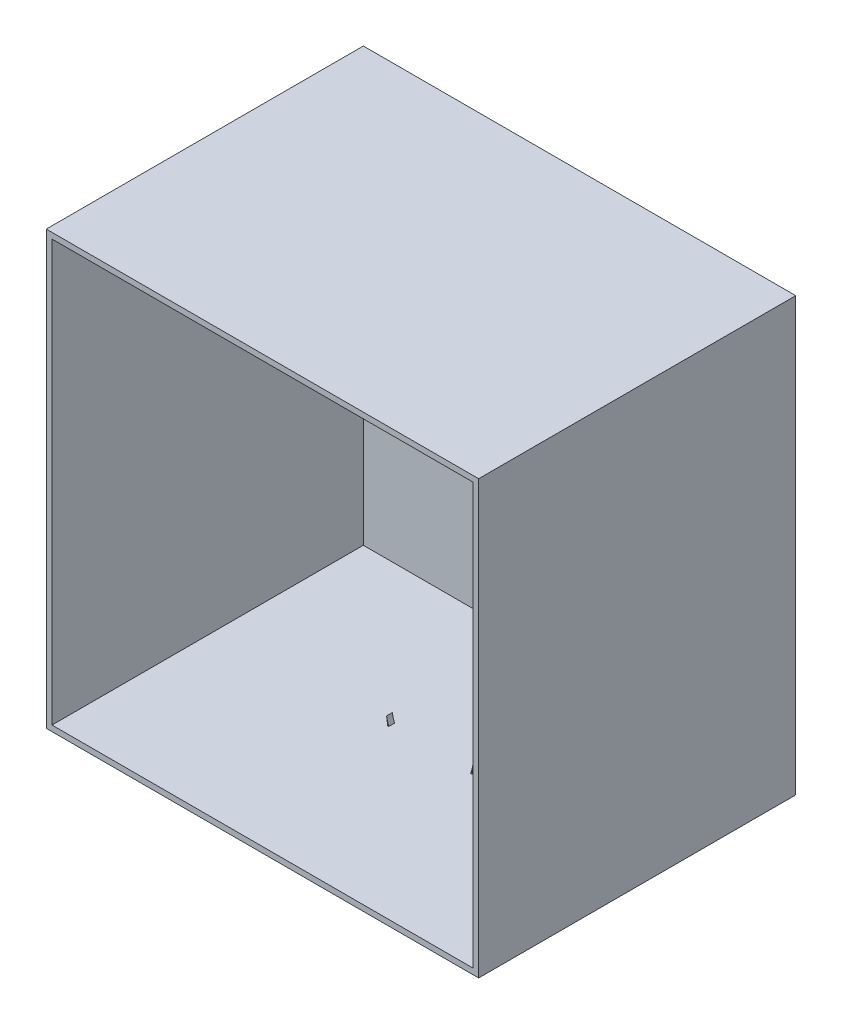
ISO-10303-21;
HEADER;
FILE_DESCRIPTION(('STEP AP214'),'2;1');
FILE_NAME('part.step','',(''),(''),'','','');
FILE_SCHEMA(('AUTOMOTIVE_DESIGN { 1 0 10303 214 1 1 1 1 }'));
ENDSEC;
DATA;
#1=APPLICATION_CONTEXT('core data for automotive mechanical design processes');
#2=APPLICATION_PROTOCOL_DEFINITION('international standard','automotive_design',2000,#1);
#3=PRODUCT_CONTEXT('',#1,'mechanical');
#4=PRODUCT('Part','Part','',(#3));
#5=PRODUCT_RELATED_PRODUCT_CATEGORY('part','',(#4));
#6=PRODUCT_DEFINITION_FORMATION('','',#4);
#7=PRODUCT_DEFINITION_CONTEXT('part definition',#1,'design');
#8=PRODUCT_DEFINITION('design','',#6,#7);
#9=PRODUCT_DEFINITION_SHAPE('','',#8);
#10=(LENGTH_UNIT() NAMED_UNIT(*) SI_UNIT(.MILLI.,.METRE.));
#11=(NAMED_UNIT(*) PLANE_ANGLE_UNIT() SI_UNIT($,.RADIAN.));
#12=(NAMED_UNIT(*) SI_UNIT($,.STERADIAN.) SOLID_ANGLE_UNIT());
#13=UNCERTAINTY_MEASURE_WITH_UNIT(LENGTH_MEASURE(1.E-05),#10,'distance_accuracy_value','');
#14=(GEOMETRIC_REPRESENTATION_CONTEXT(3) GLOBAL_UNCERTAINTY_ASSIGNED_CONTEXT((#13)) GLOBAL_UNIT_ASSIGNED_CONTEXT((#10,
#11,#12)) REPRESENTATION_CONTEXT('',''));
#15=CARTESIAN_POINT('',(0.,0.,0.));
#16=DIRECTION('',(0.,0.,1.));
#17=DIRECTION('',(1.,0.,0.));
#18=AXIS2_PLACEMENT_3D('',#15,#16,#17);
#19=CARTESIAN_POINT('',(75.,75.,110.));
#20=DIRECTION('',(-1.,0.,0.));
#21=DIRECTION('',(0.,0.,1.));
#22=AXIS2_PLACEMENT_3D('',#19,#20,#21);
#23=PLANE('',#22);
#24=DIRECTION('',(0.,1.,0.));
#25=VECTOR('',#24,1.);
#26=CARTESIAN_POINT('',(75.,75.,0.));
#27=LINE('',#26,#25);
#28=CARTESIAN_POINT('',(75.,-75.,0.));
#29=VERTEX_POINT('',#28);
#30=CARTESIAN_POINT('',(75.,75.,0.));
#31=VERTEX_POINT('',#30);
#32=EDGE_CURVE('E305',#29,#31,#27,.T.);
#33=ORIENTED_EDGE('',*,*,#32,.T.);
#34=DIRECTION('',(0.,0.,-1.));
#35=VECTOR('',#34,1.);
#36=CARTESIAN_POINT('',(75.,75.,110.));
#37=LINE('',#36,#35);
#38=CARTESIAN_POINT('',(75.,75.,110.));
#39=VERTEX_POINT('',#38);
#40=EDGE_CURVE('E355',#39,#31,#37,.T.);
#41=ORIENTED_EDGE('',*,*,#40,.F.);
#42=DIRECTION('',(0.,1.,0.));
#43=VECTOR('',#42,1.);
#44=CARTESIAN_POINT('',(75.,75.,110.));
#45=LINE('',#44,#43);
#46=CARTESIAN_POINT('',(75.,-75.,110.));
#47=VERTEX_POINT('',#46);
#48=EDGE_CURVE('E329',#47,#39,#45,.T.);
#49=ORIENTED_EDGE('',*,*,#48,.F.);
#50=DIRECTION('',(0.,0.,-1.));
#51=VECTOR('',#50,1.);
#52=CARTESIAN_POINT('',(75.,-75.,110.));
#53=LINE('',#52,#51);
#54=EDGE_CURVE('E339',#47,#29,#53,.T.);
#55=ORIENTED_EDGE('',*,*,#54,.T.);
#56=EDGE_LOOP('',(#33,#41,#49,#55));
#57=FACE_BOUND('',#56,.T.);
#58=ADVANCED_FACE('F41',(#57),#23,.F.);
#59=CARTESIAN_POINT('',(-75.,75.,110.));
#60=DIRECTION('',(0.,-1.,0.));
#61=DIRECTION('',(1.,0.,0.));
#62=AXIS2_PLACEMENT_3D('',#59,#60,#61);
#63=PLANE('',#62);
#64=DIRECTION('',(-1.,0.,0.));
#65=VECTOR('',#64,1.);
#66=CARTESIAN_POINT('',(-75.,75.,0.));
#67=LINE('',#66,#65);
#68=CARTESIAN_POINT('',(-75.,75.,0.));
#69=VERTEX_POINT('',#68);
#70=EDGE_CURVE('E342',#31,#69,#67,.T.);
#71=ORIENTED_EDGE('',*,*,#70,.T.);
#72=DIRECTION('',(0.,0.,-1.));
#73=VECTOR('',#72,1.);
#74=CARTESIAN_POINT('',(-75.,75.,110.));
#75=LINE('',#74,#73);
#76=CARTESIAN_POINT('',(-75.,75.,110.));
#77=VERTEX_POINT('',#76);
#78=EDGE_CURVE('E352',#77,#69,#75,.T.);
#79=ORIENTED_EDGE('',*,*,#78,.F.);
#80=DIRECTION('',(-1.,0.,0.));
#81=VECTOR('',#80,1.);
#82=CARTESIAN_POINT('',(-75.,75.,110.));
#83=LINE('',#82,#81);
#84=EDGE_CURVE('E332',#39,#77,#83,.T.);
#85=ORIENTED_EDGE('',*,*,#84,.F.);
#86=ORIENTED_EDGE('',*,*,#40,.T.);
#87=EDGE_LOOP('',(#71,#79,#85,#86));
#88=FACE_BOUND('',#87,.T.);
#89=ADVANCED_FACE('F436',(#88),#63,.F.);
#90=CARTESIAN_POINT('',(-75.,75.,110.));
#91=DIRECTION('',(1.,0.,0.));
#92=DIRECTION('',(0.,0.,-1.));
#93=AXIS2_PLACEMENT_3D('',#90,#91,#92);
#94=PLANE('',#93);
#95=DIRECTION('',(0.,-1.,0.));
#96=VECTOR('',#95,1.);
#97=CARTESIAN_POINT('',(-75.,75.,0.));
#98=LINE('',#97,#96);
#99=CARTESIAN_POINT('',(-75.,-75.,0.));
#100=VERTEX_POINT('',#99);
#101=EDGE_CURVE('E344',#69,#100,#98,.T.);
#102=ORIENTED_EDGE('',*,*,#101,.T.);
#103=DIRECTION('',(0.,0.,-1.));
#104=VECTOR('',#103,1.);
#105=CARTESIAN_POINT('',(-75.,-75.,110.));
#106=LINE('',#105,#104);
#107=CARTESIAN_POINT('',(-75.,-75.,110.));
#108=VERTEX_POINT('',#107);
#109=EDGE_CURVE('E349',#108,#100,#106,.T.);
#110=ORIENTED_EDGE('',*,*,#109,.F.);
#111=DIRECTION('',(0.,-1.,0.));
#112=VECTOR('',#111,1.);
#113=CARTESIAN_POINT('',(-75.,75.,110.));
#114=LINE('',#113,#112);
#115=EDGE_CURVE('E335',#77,#108,#114,.T.);
#116=ORIENTED_EDGE('',*,*,#115,.F.);
#117=ORIENTED_EDGE('',*,*,#78,.T.);
#118=EDGE_LOOP('',(#102,#110,#116,#117));
#119=FACE_BOUND('',#118,.T.);
#120=ADVANCED_FACE('F442',(#119),#94,.F.);
#121=CARTESIAN_POINT('',(-75.,-75.,110.));
#122=DIRECTION('',(0.,1.,0.));
#123=DIRECTION('',(0.,0.,1.));
#124=AXIS2_PLACEMENT_3D('',#121,#122,#123);
#125=PLANE('',#124);
#126=DIRECTION('',(1.,0.,0.));
#127=VECTOR('',#126,1.);
#128=CARTESIAN_POINT('',(-75.,-75.,50.));
#129=LINE('',#128,#127);
#130=CARTESIAN_POINT('',(-25.2423015952425,-75.,50.));
#131=VERTEX_POINT('',#130);
#132=CARTESIAN_POINT('',(-12.9644650834557,-75.,50.));
#133=VERTEX_POINT('',#132);
#134=EDGE_CURVE('E291',#131,#133,#129,.T.);
#135=ORIENTED_EDGE('',*,*,#134,.F.);
#136=DIRECTION('',(0.,0.,1.));
#137=VECTOR('',#136,1.);
#138=CARTESIAN_POINT('',(-25.2423015952425,-75.,52.));
#139=LINE('',#138,#137);
#140=CARTESIAN_POINT('',(-25.2423015952425,-75.,52.));
#141=VERTEX_POINT('',#140);
#142=EDGE_CURVE('E377',#131,#141,#139,.T.);
#143=ORIENTED_EDGE('',*,*,#142,.T.);
#144=DIRECTION('',(-1.,0.,0.));
#145=VECTOR('',#144,1.);
#146=CARTESIAN_POINT('',(-19.9446530557531,-75.,52.));
#147=LINE('',#146,#145);
#148=CARTESIAN_POINT('',(-12.9644650834557,-75.,52.));
#149=VERTEX_POINT('',#148);
#150=EDGE_CURVE('E212',#149,#141,#147,.T.);
#151=ORIENTED_EDGE('',*,*,#150,.F.);
#152=DIRECTION('',(0.,0.,-1.));
#153=VECTOR('',#152,1.);
#154=CARTESIAN_POINT('',(-12.9644650834557,-75.,52.));
#155=LINE('',#154,#153);
#156=EDGE_CURVE('E292',#133,#149,#155,.F.);
#157=ORIENTED_EDGE('',*,*,#156,.F.);
#158=EDGE_LOOP('',(#135,#143,#151,#157));
#159=FACE_BOUND('',#158,.T.);
#160=DIRECTION('',(0.,0.,1.));
#161=VECTOR('',#160,1.);
#162=CARTESIAN_POINT('',(25.2423015952425,-75.,50.));
#163=LINE('',#162,#161);
#164=CARTESIAN_POINT('',(25.2423015952425,-75.,52.));
#165=VERTEX_POINT('',#164);
#166=CARTESIAN_POINT('',(25.2423015952425,-75.,50.));
#167=VERTEX_POINT('',#166);
#168=EDGE_CURVE('E380',#165,#167,#163,.F.);
#169=ORIENTED_EDGE('',*,*,#168,.T.);
#170=CARTESIAN_POINT('',(12.9644650834557,-75.,50.));
#171=VERTEX_POINT('',#170);
#172=EDGE_CURVE('E221',#171,#167,#129,.T.);
#173=ORIENTED_EDGE('',*,*,#172,.F.);
#174=DIRECTION('',(0.,0.,-1.));
#175=VECTOR('',#174,1.);
#176=CARTESIAN_POINT('',(12.9644650834557,-75.,52.));
#177=LINE('',#176,#175);
#178=CARTESIAN_POINT('',(12.9644650834557,-75.,52.));
#179=VERTEX_POINT('',#178);
#180=EDGE_CURVE('E295',#179,#171,#177,.T.);
#181=ORIENTED_EDGE('',*,*,#180,.F.);
#182=DIRECTION('',(-1.,0.,0.));
#183=VECTOR('',#182,1.);
#184=CARTESIAN_POINT('',(19.9446530557531,-75.,52.));
#185=LINE('',#184,#183);
#186=EDGE_CURVE('E235',#165,#179,#185,.T.);
#187=ORIENTED_EDGE('',*,*,#186,.F.);
#188=EDGE_LOOP('',(#169,#173,#181,#187));
#189=FACE_BOUND('',#188,.T.);
#190=DIRECTION('',(1.,0.,0.));
#191=VECTOR('',#190,1.);
#192=CARTESIAN_POINT('',(-75.,-75.,0.));
#193=LINE('',#192,#191);
#194=EDGE_CURVE('E333',#100,#29,#193,.T.);
#195=ORIENTED_EDGE('',*,*,#194,.T.);
#196=ORIENTED_EDGE('',*,*,#54,.F.);
#197=DIRECTION('',(1.,0.,0.));
#198=VECTOR('',#197,1.);
#199=CARTESIAN_POINT('',(-75.,-75.,110.));
#200=LINE('',#199,#198);
#201=EDGE_CURVE('E337',#108,#47,#200,.T.);
#202=ORIENTED_EDGE('',*,*,#201,.F.);
#203=ORIENTED_EDGE('',*,*,#109,.T.);
#204=EDGE_LOOP('',(#195,#196,#202,#203));
#205=FACE_BOUND('',#204,.T.);
#206=ADVANCED_FACE('F396',(#159,#189,#205),#125,.F.);
#207=CARTESIAN_POINT('',(0.,0.,110.));
#208=DIRECTION('',(0.,0.,1.));
#209=DIRECTION('',(1.,0.,0.));
#210=AXIS2_PLACEMENT_3D('',#207,#208,#209);
#211=PLANE('',#210);
#212=DIRECTION('',(0.,1.,0.));
#213=VECTOR('',#212,1.);
#214=CARTESIAN_POINT('',(73.,75.,110.));
#215=LINE('',#214,#213);
#216=CARTESIAN_POINT('',(73.,-73.,110.));
#217=VERTEX_POINT('',#216);
#218=CARTESIAN_POINT('',(73.,73.,110.));
#219=VERTEX_POINT('',#218);
#220=EDGE_CURVE('E321',#217,#219,#215,.T.);
#221=ORIENTED_EDGE('',*,*,#220,.F.);
#222=DIRECTION('',(1.,0.,0.));
#223=VECTOR('',#222,1.);
#224=CARTESIAN_POINT('',(-75.,-73.,110.));
#225=LINE('',#224,#223);
#226=CARTESIAN_POINT('',(-73.,-73.,110.));
#227=VERTEX_POINT('',#226);
#228=EDGE_CURVE('E311',#227,#217,#225,.T.);
#229=ORIENTED_EDGE('',*,*,#228,.F.);
#230=DIRECTION('',(0.,-1.,0.));
#231=VECTOR('',#230,1.);
#232=CARTESIAN_POINT('',(-73.,75.,110.));
#233=LINE('',#232,#231);
#234=CARTESIAN_POINT('',(-73.,73.,110.));
#235=VERTEX_POINT('',#234);
#236=EDGE_CURVE('E325',#235,#227,#233,.T.);
#237=ORIENTED_EDGE('',*,*,#236,.F.);
#238=DIRECTION('',(-1.,0.,0.));
#239=VECTOR('',#238,1.);
#240=CARTESIAN_POINT('',(-75.,73.,110.));
#241=LINE('',#240,#239);
#242=EDGE_CURVE('E323',#219,#235,#241,.T.);
#243=ORIENTED_EDGE('',*,*,#242,.F.);
#244=EDGE_LOOP('',(#221,#229,#237,#243));
#245=FACE_BOUND('',#244,.T.);
#246=ORIENTED_EDGE('',*,*,#48,.T.);
#247=ORIENTED_EDGE('',*,*,#84,.T.);
#248=ORIENTED_EDGE('',*,*,#115,.T.);
#249=ORIENTED_EDGE('',*,*,#201,.T.);
#250=EDGE_LOOP('',(#246,#247,#248,#249));
#251=FACE_BOUND('',#250,.T.);
#252=ADVANCED_FACE('F558',(#245,#251),#211,.T.);
#253=CARTESIAN_POINT('',(0.,0.,0.));
#254=DIRECTION('',(0.,0.,1.));
#255=DIRECTION('',(1.,0.,0.));
#256=AXIS2_PLACEMENT_3D('',#253,#254,#255);
#257=PLANE('',#256);
#258=ORIENTED_EDGE('',*,*,#32,.F.);
#259=ORIENTED_EDGE('',*,*,#194,.F.);
#260=ORIENTED_EDGE('',*,*,#101,.F.);
#261=ORIENTED_EDGE('',*,*,#70,.F.);
#262=EDGE_LOOP('',(#258,#259,#260,#261));
#263=FACE_BOUND('',#262,.T.);
#264=ADVANCED_FACE('F573',(#263),#257,.F.);
#265=CARTESIAN_POINT('',(73.,75.,110.));
#266=DIRECTION('',(-1.,0.,0.));
#267=DIRECTION('',(0.,0.,1.));
#268=AXIS2_PLACEMENT_3D('',#265,#266,#267);
#269=PLANE('',#268);
#270=DIRECTION('',(0.,1.,0.));
#271=VECTOR('',#270,1.);
#272=CARTESIAN_POINT('',(73.,75.,2.));
#273=LINE('',#272,#271);
#274=CARTESIAN_POINT('',(73.,-73.,2.));
#275=VERTEX_POINT('',#274);
#276=CARTESIAN_POINT('',(73.,73.,2.));
#277=VERTEX_POINT('',#276);
#278=EDGE_CURVE('E298',#275,#277,#273,.T.);
#279=ORIENTED_EDGE('',*,*,#278,.F.);
#280=DIRECTION('',(0.,0.,-1.));
#281=VECTOR('',#280,1.);
#282=CARTESIAN_POINT('',(73.,-73.,110.));
#283=LINE('',#282,#281);
#284=EDGE_CURVE('E307',#217,#275,#283,.T.);
#285=ORIENTED_EDGE('',*,*,#284,.F.);
#286=ORIENTED_EDGE('',*,*,#220,.T.);
#287=DIRECTION('',(0.,0.,-1.));
#288=VECTOR('',#287,1.);
#289=CARTESIAN_POINT('',(73.,73.,110.));
#290=LINE('',#289,#288);
#291=EDGE_CURVE('E302',#219,#277,#290,.T.);
#292=ORIENTED_EDGE('',*,*,#291,.T.);
#293=EDGE_LOOP('',(#279,#285,#286,#292));
#294=FACE_BOUND('',#293,.T.);
#295=ADVANCED_FACE('F581',(#294),#269,.T.);
#296=CARTESIAN_POINT('',(-75.,73.,110.));
#297=DIRECTION('',(0.,-1.,0.));
#298=DIRECTION('',(1.,0.,0.));
#299=AXIS2_PLACEMENT_3D('',#296,#297,#298);
#300=PLANE('',#299);
#301=DIRECTION('',(-1.,0.,0.));
#302=VECTOR('',#301,1.);
#303=CARTESIAN_POINT('',(-75.,73.,2.));
#304=LINE('',#303,#302);
#305=CARTESIAN_POINT('',(-73.,73.,2.));
#306=VERTEX_POINT('',#305);
#307=EDGE_CURVE('E301',#277,#306,#304,.T.);
#308=ORIENTED_EDGE('',*,*,#307,.F.);
#309=ORIENTED_EDGE('',*,*,#291,.F.);
#310=ORIENTED_EDGE('',*,*,#242,.T.);
#311=DIRECTION('',(0.,0.,-1.));
#312=VECTOR('',#311,1.);
#313=CARTESIAN_POINT('',(-73.,73.,110.));
#314=LINE('',#313,#312);
#315=EDGE_CURVE('E306',#235,#306,#314,.T.);
#316=ORIENTED_EDGE('',*,*,#315,.T.);
#317=EDGE_LOOP('',(#308,#309,#310,#316));
#318=FACE_BOUND('',#317,.T.);
#319=ADVANCED_FACE('F588',(#318),#300,.T.);
#320=CARTESIAN_POINT('',(-73.,75.,110.));
#321=DIRECTION('',(1.,0.,0.));
#322=DIRECTION('',(0.,0.,-1.));
#323=AXIS2_PLACEMENT_3D('',#320,#321,#322);
#324=PLANE('',#323);
#325=DIRECTION('',(0.,-1.,0.));
#326=VECTOR('',#325,1.);
#327=CARTESIAN_POINT('',(-73.,75.,2.));
#328=LINE('',#327,#326);
#329=CARTESIAN_POINT('',(-73.,-73.,2.));
#330=VERTEX_POINT('',#329);
#331=EDGE_CURVE('E313',#306,#330,#328,.T.);
#332=ORIENTED_EDGE('',*,*,#331,.F.);
#333=ORIENTED_EDGE('',*,*,#315,.F.);
#334=ORIENTED_EDGE('',*,*,#236,.T.);
#335=DIRECTION('',(0.,0.,-1.));
#336=VECTOR('',#335,1.);
#337=CARTESIAN_POINT('',(-73.,-73.,110.));
#338=LINE('',#337,#336);
#339=EDGE_CURVE('E310',#227,#330,#338,.T.);
#340=ORIENTED_EDGE('',*,*,#339,.T.);
#341=EDGE_LOOP('',(#332,#333,#334,#340));
#342=FACE_BOUND('',#341,.T.);
#343=ADVANCED_FACE('F596',(#342),#324,.T.);
#344=CARTESIAN_POINT('',(-75.,-73.,110.));
#345=DIRECTION('',(0.,1.,0.));
#346=DIRECTION('',(0.,0.,1.));
#347=AXIS2_PLACEMENT_3D('',#344,#345,#346);
#348=PLANE('',#347);
#349=DIRECTION('',(1.,0.,0.));
#350=VECTOR('',#349,1.);
#351=CARTESIAN_POINT('',(-75.,-73.,52.));
#352=LINE('',#351,#350);
#353=CARTESIAN_POINT('',(-14.5727344051975,-73.,52.));
#354=VERTEX_POINT('',#353);
#355=CARTESIAN_POINT('',(-14.1507379408053,-73.,52.));
#356=VERTEX_POINT('',#355);
#357=EDGE_CURVE('E370',#354,#356,#352,.T.);
#358=ORIENTED_EDGE('',*,*,#357,.F.);
#359=DIRECTION('',(0.,0.,-1.));
#360=VECTOR('',#359,1.);
#361=CARTESIAN_POINT('',(-14.5727344051975,-73.,110.));
#362=LINE('',#361,#360);
#363=CARTESIAN_POINT('',(-14.5727344051975,-73.,50.));
#364=VERTEX_POINT('',#363);
#365=EDGE_CURVE('E371',#354,#364,#362,.T.);
#366=ORIENTED_EDGE('',*,*,#365,.T.);
#367=DIRECTION('',(1.,0.,0.));
#368=VECTOR('',#367,1.);
#369=CARTESIAN_POINT('',(-75.,-73.,50.));
#370=LINE('',#369,#368);
#371=CARTESIAN_POINT('',(-14.1507379408053,-73.,50.));
#372=VERTEX_POINT('',#371);
#373=EDGE_CURVE('E362',#364,#372,#370,.T.);
#374=ORIENTED_EDGE('',*,*,#373,.T.);
#375=DIRECTION('',(0.,0.,-1.));
#376=VECTOR('',#375,1.);
#377=CARTESIAN_POINT('',(-14.1507379408053,-73.,52.));
#378=LINE('',#377,#376);
#379=EDGE_CURVE('E374',#372,#356,#378,.F.);
#380=ORIENTED_EDGE('',*,*,#379,.T.);
#381=EDGE_LOOP('',(#358,#366,#374,#380));
#382=FACE_BOUND('',#381,.T.);
#383=CARTESIAN_POINT('',(14.1507379408053,-73.,52.));
#384=VERTEX_POINT('',#383);
#385=CARTESIAN_POINT('',(14.5727344051975,-73.,52.));
#386=VERTEX_POINT('',#385);
#387=EDGE_CURVE('E368',#384,#386,#352,.T.);
#388=ORIENTED_EDGE('',*,*,#387,.F.);
#389=DIRECTION('',(0.,0.,-1.));
#390=VECTOR('',#389,1.);
#391=CARTESIAN_POINT('',(14.1507379408053,-73.,52.));
#392=LINE('',#391,#390);
#393=CARTESIAN_POINT('',(14.1507379408053,-73.,50.));
#394=VERTEX_POINT('',#393);
#395=EDGE_CURVE('E361',#384,#394,#392,.T.);
#396=ORIENTED_EDGE('',*,*,#395,.T.);
#397=CARTESIAN_POINT('',(14.5727344051975,-73.,50.));
#398=VERTEX_POINT('',#397);
#399=EDGE_CURVE('E358',#394,#398,#370,.T.);
#400=ORIENTED_EDGE('',*,*,#399,.T.);
#401=DIRECTION('',(0.,0.,1.));
#402=VECTOR('',#401,1.);
#403=CARTESIAN_POINT('',(14.5727344051975,-73.,110.));
#404=LINE('',#403,#402);
#405=EDGE_CURVE('E365',#398,#386,#404,.T.);
#406=ORIENTED_EDGE('',*,*,#405,.T.);
#407=EDGE_LOOP('',(#388,#396,#400,#406));
#408=FACE_BOUND('',#407,.T.);
#409=DIRECTION('',(1.,0.,0.));
#410=VECTOR('',#409,1.);
#411=CARTESIAN_POINT('',(-75.,-73.,2.));
#412=LINE('',#411,#410);
#413=EDGE_CURVE('E317',#330,#275,#412,.T.);
#414=ORIENTED_EDGE('',*,*,#413,.F.);
#415=ORIENTED_EDGE('',*,*,#339,.F.);
#416=ORIENTED_EDGE('',*,*,#228,.T.);
#417=ORIENTED_EDGE('',*,*,#284,.T.);
#418=EDGE_LOOP('',(#414,#415,#416,#417));
#419=FACE_BOUND('',#418,.T.);
#420=ADVANCED_FACE('F479',(#382,#408,#419),#348,.T.);
#421=CARTESIAN_POINT('',(0.,0.,2.));
#422=DIRECTION('',(0.,0.,1.));
#423=DIRECTION('',(1.,0.,0.));
#424=AXIS2_PLACEMENT_3D('',#421,#422,#423);
#425=PLANE('',#424);
#426=ORIENTED_EDGE('',*,*,#278,.T.);
#427=ORIENTED_EDGE('',*,*,#307,.T.);
#428=ORIENTED_EDGE('',*,*,#331,.T.);
#429=ORIENTED_EDGE('',*,*,#413,.T.);
#430=EDGE_LOOP('',(#426,#427,#428,#429));
#431=FACE_BOUND('',#430,.T.);
#432=ADVANCED_FACE('F490',(#431),#425,.T.);
#433=CARTESIAN_POINT('',(-5.01506980991759,-68.9331132543083,50.));
#434=DIRECTION('',(0.,0.,1.));
#435=DIRECTION('',(1.,0.,0.));
#436=AXIS2_PLACEMENT_3D('',#433,#434,#435);
#437=PLANE('',#436);
#438=ORIENTED_EDGE('',*,*,#399,.F.);
#439=CARTESIAN_POINT('',(5.01506980991759,-68.9331132543083,50.));
#440=DIRECTION('',(0.,0.,-1.));
#441=DIRECTION('',(1.,0.,0.));
#442=AXIS2_PLACEMENT_3D('',#439,#440,#441);
#443=CIRCLE('',#442,10.);
#444=CARTESIAN_POINT('',(14.932632037518,-70.2145029146669,50.));
#445=VERTEX_POINT('',#444);
#446=EDGE_CURVE('E263',#445,#394,#443,.T.);
#447=ORIENTED_EDGE('',*,*,#446,.F.);
#448=DIRECTION('',(0.128138966035846,0.991756222760041,0.));
#449=VECTOR('',#448,1.);
#450=CARTESIAN_POINT('',(14.3143262135569,-75.,50.));
#451=LINE('',#450,#449);
#452=EDGE_CURVE('E260',#398,#445,#451,.T.);
#453=ORIENTED_EDGE('',*,*,#452,.F.);
#454=EDGE_LOOP('',(#438,#447,#453));
#455=FACE_BOUND('',#454,.T.);
#456=ADVANCED_FACE('F473',(#455),#437,.F.);
#457=CARTESIAN_POINT('',(-5.01506980991759,-68.9331132543083,52.));
#458=DIRECTION('',(0.,0.,1.));
#459=DIRECTION('',(1.,0.,0.));
#460=AXIS2_PLACEMENT_3D('',#457,#458,#459);
#461=PLANE('',#460);
#462=CARTESIAN_POINT('',(5.01506980991759,-68.9331132543083,52.));
#463=DIRECTION('',(0.,0.,-1.));
#464=DIRECTION('',(1.,0.,0.));
#465=AXIS2_PLACEMENT_3D('',#462,#463,#464);
#466=CIRCLE('',#465,10.);
#467=CARTESIAN_POINT('',(14.932632037518,-70.2145029146669,52.));
#468=VERTEX_POINT('',#467);
#469=EDGE_CURVE('E240',#468,#384,#466,.T.);
#470=ORIENTED_EDGE('',*,*,#469,.T.);
#471=ORIENTED_EDGE('',*,*,#387,.T.);
#472=DIRECTION('',(0.128138966035846,0.991756222760041,0.));
#473=VECTOR('',#472,1.);
#474=CARTESIAN_POINT('',(14.3143262135569,-75.,52.));
#475=LINE('',#474,#473);
#476=EDGE_CURVE('E237',#386,#468,#475,.T.);
#477=ORIENTED_EDGE('',*,*,#476,.T.);
#478=EDGE_LOOP('',(#470,#471,#477));
#479=FACE_BOUND('',#478,.T.);
#480=ADVANCED_FACE('F462',(#479),#461,.T.);
#481=CARTESIAN_POINT('',(5.01506980991759,-68.9331132543083,52.));
#482=DIRECTION('',(0.,0.,-1.));
#483=DIRECTION('',(-1.,0.,0.));
#484=AXIS2_PLACEMENT_3D('',#481,#482,#483);
#485=CYLINDRICAL_SURFACE('',#484,10.);
#486=ORIENTED_EDGE('',*,*,#395,.F.);
#487=ORIENTED_EDGE('',*,*,#469,.F.);
#488=DIRECTION('',(0.,0.,-1.));
#489=VECTOR('',#488,1.);
#490=CARTESIAN_POINT('',(14.932632037518,-70.2145029146669,52.));
#491=LINE('',#490,#489);
#492=EDGE_CURVE('E283',#468,#445,#491,.T.);
#493=ORIENTED_EDGE('',*,*,#492,.T.);
#494=ORIENTED_EDGE('',*,*,#446,.T.);
#495=EDGE_LOOP('',(#486,#487,#493,#494));
#496=FACE_BOUND('',#495,.T.);
#497=ADVANCED_FACE('F458',(#496),#485,.F.);
#498=CARTESIAN_POINT('',(14.3143262135569,-75.,52.));
#499=DIRECTION('',(-0.991756222760041,0.128138966035847,0.));
#500=DIRECTION('',(-0.128138966035847,-0.991756222760041,0.));
#501=AXIS2_PLACEMENT_3D('',#498,#499,#500);
#502=PLANE('',#501);
#503=ORIENTED_EDGE('',*,*,#405,.F.);
#504=ORIENTED_EDGE('',*,*,#452,.T.);
#505=ORIENTED_EDGE('',*,*,#492,.F.);
#506=ORIENTED_EDGE('',*,*,#476,.F.);
#507=EDGE_LOOP('',(#503,#504,#505,#506));
#508=FACE_BOUND('',#507,.T.);
#509=ADVANCED_FACE('F461',(#508),#502,.F.);
#510=ORIENTED_EDGE('',*,*,#373,.F.);
#511=DIRECTION('',(0.128138966035846,-0.991756222760041,0.));
#512=VECTOR('',#511,1.);
#513=CARTESIAN_POINT('',(-14.3143262135569,-75.,50.));
#514=LINE('',#513,#512);
#515=CARTESIAN_POINT('',(-14.932632037518,-70.2145029146669,50.));
#516=VERTEX_POINT('',#515);
#517=EDGE_CURVE('E272',#516,#364,#514,.T.);
#518=ORIENTED_EDGE('',*,*,#517,.F.);
#519=CARTESIAN_POINT('',(-5.01506980991759,-68.9331132543083,50.));
#520=DIRECTION('',(0.,0.,-1.));
#521=DIRECTION('',(1.,0.,0.));
#522=AXIS2_PLACEMENT_3D('',#519,#520,#521);
#523=CIRCLE('',#522,10.);
#524=EDGE_CURVE('E268',#372,#516,#523,.T.);
#525=ORIENTED_EDGE('',*,*,#524,.F.);
#526=EDGE_LOOP('',(#510,#518,#525));
#527=FACE_BOUND('',#526,.T.);
#528=ADVANCED_FACE('F465',(#527),#437,.F.);
#529=DIRECTION('',(0.128138966035846,-0.991756222760041,0.));
#530=VECTOR('',#529,1.);
#531=CARTESIAN_POINT('',(-14.3143262135569,-75.,52.));
#532=LINE('',#531,#530);
#533=CARTESIAN_POINT('',(-14.932632037518,-70.2145029146669,52.));
#534=VERTEX_POINT('',#533);
#535=EDGE_CURVE('E248',#534,#354,#532,.T.);
#536=ORIENTED_EDGE('',*,*,#535,.T.);
#537=ORIENTED_EDGE('',*,*,#357,.T.);
#538=CARTESIAN_POINT('',(-5.01506980991759,-68.9331132543083,52.));
#539=DIRECTION('',(0.,0.,-1.));
#540=DIRECTION('',(1.,0.,0.));
#541=AXIS2_PLACEMENT_3D('',#538,#539,#540);
#542=CIRCLE('',#541,10.);
#543=EDGE_CURVE('E245',#356,#534,#542,.T.);
#544=ORIENTED_EDGE('',*,*,#543,.T.);
#545=EDGE_LOOP('',(#536,#537,#544));
#546=FACE_BOUND('',#545,.T.);
#547=ADVANCED_FACE('F470',(#546),#461,.T.);
#548=CARTESIAN_POINT('',(-14.3143262135569,-75.,52.));
#549=DIRECTION('',(0.991756222760041,0.128138966035847,0.));
#550=DIRECTION('',(-0.128138966035847,0.991756222760041,0.));
#551=AXIS2_PLACEMENT_3D('',#548,#549,#550);
#552=PLANE('',#551);
#553=ORIENTED_EDGE('',*,*,#365,.F.);
#554=ORIENTED_EDGE('',*,*,#535,.F.);
#555=DIRECTION('',(0.,0.,-1.));
#556=VECTOR('',#555,1.);
#557=CARTESIAN_POINT('',(-14.932632037518,-70.2145029146669,52.));
#558=LINE('',#557,#556);
#559=EDGE_CURVE('E251',#534,#516,#558,.T.);
#560=ORIENTED_EDGE('',*,*,#559,.T.);
#561=ORIENTED_EDGE('',*,*,#517,.T.);
#562=EDGE_LOOP('',(#553,#554,#560,#561));
#563=FACE_BOUND('',#562,.T.);
#564=ADVANCED_FACE('F493',(#563),#552,.F.);
#565=CARTESIAN_POINT('',(-5.01506980991759,-68.9331132543083,52.));
#566=DIRECTION('',(0.,0.,-1.));
#567=DIRECTION('',(-1.,0.,0.));
#568=AXIS2_PLACEMENT_3D('',#565,#566,#567);
#569=CYLINDRICAL_SURFACE('',#568,10.);
#570=ORIENTED_EDGE('',*,*,#379,.F.);
#571=ORIENTED_EDGE('',*,*,#524,.T.);
#572=ORIENTED_EDGE('',*,*,#559,.F.);
#573=ORIENTED_EDGE('',*,*,#543,.F.);
#574=EDGE_LOOP('',(#570,#571,#572,#573));
#575=FACE_BOUND('',#574,.T.);
#576=ADVANCED_FACE('F456',(#575),#569,.F.);
#577=CARTESIAN_POINT('',(5.01506980991759,-78.9331132543083,52.));
#578=VERTEX_POINT('',#577);
#579=EDGE_CURVE('E239',#179,#578,#466,.T.);
#580=ORIENTED_EDGE('',*,*,#579,.F.);
#581=ORIENTED_EDGE('',*,*,#180,.T.);
#582=CARTESIAN_POINT('',(5.01506980991759,-78.9331132543083,50.));
#583=VERTEX_POINT('',#582);
#584=EDGE_CURVE('E262',#171,#583,#443,.T.);
#585=ORIENTED_EDGE('',*,*,#584,.T.);
#586=DIRECTION('',(0.,0.,-1.));
#587=VECTOR('',#586,1.);
#588=CARTESIAN_POINT('',(5.01506980991759,-78.9331132543083,52.));
#589=LINE('',#588,#587);
#590=EDGE_CURVE('E280',#578,#583,#589,.T.);
#591=ORIENTED_EDGE('',*,*,#590,.F.);
#592=EDGE_LOOP('',(#580,#581,#585,#591));
#593=FACE_BOUND('',#592,.T.);
#594=ADVANCED_FACE('F411',(#593),#485,.F.);
#595=CARTESIAN_POINT('',(-5.01506980991759,-78.9331132543083,50.));
#596=VERTEX_POINT('',#595);
#597=EDGE_CURVE('E269',#596,#133,#523,.T.);
#598=ORIENTED_EDGE('',*,*,#597,.T.);
#599=ORIENTED_EDGE('',*,*,#156,.T.);
#600=CARTESIAN_POINT('',(-5.01506980991759,-78.9331132543083,52.));
#601=VERTEX_POINT('',#600);
#602=EDGE_CURVE('E246',#601,#149,#542,.T.);
#603=ORIENTED_EDGE('',*,*,#602,.F.);
#604=DIRECTION('',(0.,0.,-1.));
#605=VECTOR('',#604,1.);
#606=CARTESIAN_POINT('',(-5.01506980991759,-78.9331132543083,52.));
#607=LINE('',#606,#605);
#608=EDGE_CURVE('E277',#601,#596,#607,.T.);
#609=ORIENTED_EDGE('',*,*,#608,.T.);
#610=EDGE_LOOP('',(#598,#599,#603,#609));
#611=FACE_BOUND('',#610,.T.);
#612=ADVANCED_FACE('F400',(#611),#569,.F.);
#613=ORIENTED_EDGE('',*,*,#602,.T.);
#614=ORIENTED_EDGE('',*,*,#150,.T.);
#615=CARTESIAN_POINT('',(-25.2423015952425,-85.,52.));
#616=DIRECTION('',(0.,0.,1.));
#617=DIRECTION('',(1.,0.,0.));
#618=AXIS2_PLACEMENT_3D('',#615,#616,#617);
#619=CIRCLE('',#618,10.);
#620=CARTESIAN_POINT('',(-17.1305508735074,-79.1519661228383,52.));
#621=VERTEX_POINT('',#620);
#622=EDGE_CURVE('E11',#141,#621,#619,.F.);
#623=ORIENTED_EDGE('',*,*,#622,.T.);
#624=CARTESIAN_POINT('',(-9.01880015177234,-73.3039322456766,52.));
#625=DIRECTION('',(0.,0.,1.));
#626=DIRECTION('',(1.,0.,0.));
#627=AXIS2_PLACEMENT_3D('',#624,#625,#626);
#628=CIRCLE('',#627,10.);
#629=CARTESIAN_POINT('',(-8.07155314821271,-83.258967309113,52.));
#630=VERTEX_POINT('',#629);
#631=EDGE_CURVE('E204',#621,#630,#628,.T.);
#632=ORIENTED_EDGE('',*,*,#631,.T.);
#633=DIRECTION('',(0.995503506343636,0.0947247003559636,0.));
#634=VECTOR('',#633,1.);
#635=CARTESIAN_POINT('',(-8.07155314821271,-83.258967309113,52.));
#636=LINE('',#635,#634);
#637=CARTESIAN_POINT('',(0.,-82.4909384187077,52.));
#638=VERTEX_POINT('',#637);
#639=EDGE_CURVE('E209',#630,#638,#636,.T.);
#640=ORIENTED_EDGE('',*,*,#639,.T.);
#641=DIRECTION('',(0.995503506343636,-0.0947247003559636,0.));
#642=VECTOR('',#641,1.);
#643=CARTESIAN_POINT('',(8.07155314821271,-83.258967309113,52.));
#644=LINE('',#643,#642);
#645=CARTESIAN_POINT('',(8.07155314821271,-83.258967309113,52.));
#646=VERTEX_POINT('',#645);
#647=EDGE_CURVE('E227',#638,#646,#644,.T.);
#648=ORIENTED_EDGE('',*,*,#647,.T.);
#649=CARTESIAN_POINT('',(9.01880015177234,-73.3039322456766,52.));
#650=DIRECTION('',(0.,0.,1.));
#651=DIRECTION('',(1.,0.,0.));
#652=AXIS2_PLACEMENT_3D('',#649,#650,#651);
#653=CIRCLE('',#652,10.);
#654=CARTESIAN_POINT('',(17.1305508735074,-79.1519661228383,52.));
#655=VERTEX_POINT('',#654);
#656=EDGE_CURVE('E229',#646,#655,#653,.T.);
#657=ORIENTED_EDGE('',*,*,#656,.T.);
#658=CARTESIAN_POINT('',(25.2423015952425,-85.,52.));
#659=DIRECTION('',(0.,0.,1.));
#660=DIRECTION('',(1.,0.,0.));
#661=AXIS2_PLACEMENT_3D('',#658,#659,#660);
#662=CIRCLE('',#661,10.);
#663=EDGE_CURVE('E389',#655,#165,#662,.F.);
#664=ORIENTED_EDGE('',*,*,#663,.T.);
#665=ORIENTED_EDGE('',*,*,#186,.T.);
#666=ORIENTED_EDGE('',*,*,#579,.T.);
#667=DIRECTION('',(-1.,0.,0.));
#668=VECTOR('',#667,1.);
#669=CARTESIAN_POINT('',(-5.01506980991759,-78.9331132543083,52.));
#670=LINE('',#669,#668);
#671=EDGE_CURVE('E243',#578,#601,#670,.T.);
#672=ORIENTED_EDGE('',*,*,#671,.T.);
#673=EDGE_LOOP('',(#613,#614,#623,#632,#640,#648,#657,#664,#665,#666,#672));
#674=FACE_BOUND('',#673,.T.);
#675=ADVANCED_FACE('F207',(#674),#461,.T.);
#676=CARTESIAN_POINT('',(-9.01880015177234,-73.3039322456766,50.));
#677=DIRECTION('',(0.,0.,1.));
#678=DIRECTION('',(1.,0.,0.));
#679=AXIS2_PLACEMENT_3D('',#676,#677,#678);
#680=CIRCLE('',#679,10.);
#681=CARTESIAN_POINT('',(-17.1305508735074,-79.1519661228383,50.));
#682=VERTEX_POINT('',#681);
#683=CARTESIAN_POINT('',(-8.07155314821271,-83.258967309113,50.));
#684=VERTEX_POINT('',#683);
#685=EDGE_CURVE('E218',#682,#684,#680,.T.);
#686=ORIENTED_EDGE('',*,*,#685,.F.);
#687=CARTESIAN_POINT('',(-25.2423015952425,-85.,50.));
#688=DIRECTION('',(0.,0.,1.));
#689=DIRECTION('',(1.,0.,0.));
#690=AXIS2_PLACEMENT_3D('',#687,#688,#689);
#691=CIRCLE('',#690,10.);
#692=EDGE_CURVE('E49',#682,#131,#691,.T.);
#693=ORIENTED_EDGE('',*,*,#692,.T.);
#694=ORIENTED_EDGE('',*,*,#134,.T.);
#695=ORIENTED_EDGE('',*,*,#597,.F.);
#696=DIRECTION('',(-1.,0.,0.));
#697=VECTOR('',#696,1.);
#698=CARTESIAN_POINT('',(-5.01506980991759,-78.9331132543083,50.));
#699=LINE('',#698,#697);
#700=EDGE_CURVE('E266',#583,#596,#699,.T.);
#701=ORIENTED_EDGE('',*,*,#700,.F.);
#702=ORIENTED_EDGE('',*,*,#584,.F.);
#703=ORIENTED_EDGE('',*,*,#172,.T.);
#704=CARTESIAN_POINT('',(25.2423015952425,-85.,50.));
#705=DIRECTION('',(0.,0.,1.));
#706=DIRECTION('',(1.,0.,0.));
#707=AXIS2_PLACEMENT_3D('',#704,#705,#706);
#708=CIRCLE('',#707,10.);
#709=CARTESIAN_POINT('',(17.1305508735074,-79.1519661228383,50.));
#710=VERTEX_POINT('',#709);
#711=EDGE_CURVE('E387',#167,#710,#708,.T.);
#712=ORIENTED_EDGE('',*,*,#711,.T.);
#713=CARTESIAN_POINT('',(9.01880015177234,-73.3039322456766,50.));
#714=DIRECTION('',(0.,0.,1.));
#715=DIRECTION('',(1.,0.,0.));
#716=AXIS2_PLACEMENT_3D('',#713,#714,#715);
#717=CIRCLE('',#716,10.);
#718=CARTESIAN_POINT('',(8.07155314821271,-83.258967309113,50.));
#719=VERTEX_POINT('',#718);
#720=EDGE_CURVE('E257',#719,#710,#717,.T.);
#721=ORIENTED_EDGE('',*,*,#720,.F.);
#722=DIRECTION('',(0.995503506343636,-0.0947247003559636,0.));
#723=VECTOR('',#722,1.);
#724=CARTESIAN_POINT('',(8.07155314821271,-83.258967309113,50.));
#725=LINE('',#724,#723);
#726=CARTESIAN_POINT('',(0.,-82.4909384187077,50.));
#727=VERTEX_POINT('',#726);
#728=EDGE_CURVE('E255',#727,#719,#725,.T.);
#729=ORIENTED_EDGE('',*,*,#728,.F.);
#730=DIRECTION('',(0.995503506343636,0.0947247003559636,0.));
#731=VECTOR('',#730,1.);
#732=CARTESIAN_POINT('',(-8.07155314821271,-83.258967309113,50.));
#733=LINE('',#732,#731);
#734=EDGE_CURVE('E253',#684,#727,#733,.T.);
#735=ORIENTED_EDGE('',*,*,#734,.F.);
#736=EDGE_LOOP('',(#686,#693,#694,#695,#701,#702,#703,#712,#721,#729,#735));
#737=FACE_BOUND('',#736,.T.);
#738=ADVANCED_FACE('F393',(#737),#437,.F.);
#739=CARTESIAN_POINT('',(-9.01880015177234,-73.3039322456766,52.));
#740=DIRECTION('',(0.,0.,-1.));
#741=DIRECTION('',(-1.,0.,0.));
#742=AXIS2_PLACEMENT_3D('',#739,#740,#741);
#743=CYLINDRICAL_SURFACE('',#742,10.);
#744=ORIENTED_EDGE('',*,*,#631,.F.);
#745=DIRECTION('',(0.,0.,-1.));
#746=VECTOR('',#745,1.);
#747=CARTESIAN_POINT('',(-17.1305508735074,-79.1519661228383,52.));
#748=LINE('',#747,#746);
#749=EDGE_CURVE('E385',#621,#682,#748,.T.);
#750=ORIENTED_EDGE('',*,*,#749,.T.);
#751=ORIENTED_EDGE('',*,*,#685,.T.);
#752=DIRECTION('',(0.,0.,-1.));
#753=VECTOR('',#752,1.);
#754=CARTESIAN_POINT('',(-8.07155314821271,-83.258967309113,52.));
#755=LINE('',#754,#753);
#756=EDGE_CURVE('E215',#630,#684,#755,.T.);
#757=ORIENTED_EDGE('',*,*,#756,.F.);
#758=EDGE_LOOP('',(#744,#750,#751,#757));
#759=FACE_BOUND('',#758,.T.);
#760=ADVANCED_FACE('F216',(#759),#743,.T.);
#761=CARTESIAN_POINT('',(-8.07155314821271,-83.258967309113,52.));
#762=DIRECTION('',(-0.0947247003559636,0.995503506343636,0.));
#763=DIRECTION('',(-0.995503506343636,-0.0947247003559636,0.));
#764=AXIS2_PLACEMENT_3D('',#761,#762,#763);
#765=PLANE('',#764);
#766=ORIENTED_EDGE('',*,*,#734,.T.);
#767=DIRECTION('',(0.,0.,-1.));
#768=VECTOR('',#767,1.);
#769=CARTESIAN_POINT('',(0.,-82.4909384187077,52.));
#770=LINE('',#769,#768);
#771=EDGE_CURVE('E222',#638,#727,#770,.T.);
#772=ORIENTED_EDGE('',*,*,#771,.F.);
#773=ORIENTED_EDGE('',*,*,#639,.F.);
#774=ORIENTED_EDGE('',*,*,#756,.T.);
#775=EDGE_LOOP('',(#766,#772,#773,#774));
#776=FACE_BOUND('',#775,.T.);
#777=ADVANCED_FACE('F224',(#776),#765,.F.);
#778=CARTESIAN_POINT('',(8.07155314821271,-83.258967309113,52.));
#779=DIRECTION('',(0.0947247003559636,0.995503506343636,0.));
#780=DIRECTION('',(-0.995503506343636,0.0947247003559636,0.));
#781=AXIS2_PLACEMENT_3D('',#778,#779,#780);
#782=PLANE('',#781);
#783=ORIENTED_EDGE('',*,*,#728,.T.);
#784=DIRECTION('',(0.,0.,-1.));
#785=VECTOR('',#784,1.);
#786=CARTESIAN_POINT('',(8.07155314821271,-83.258967309113,52.));
#787=LINE('',#786,#785);
#788=EDGE_CURVE('E286',#646,#719,#787,.T.);
#789=ORIENTED_EDGE('',*,*,#788,.F.);
#790=ORIENTED_EDGE('',*,*,#647,.F.);
#791=ORIENTED_EDGE('',*,*,#771,.T.);
#792=EDGE_LOOP('',(#783,#789,#790,#791));
#793=FACE_BOUND('',#792,.T.);
#794=ADVANCED_FACE('F426',(#793),#782,.F.);
#795=CARTESIAN_POINT('',(9.01880015177234,-73.3039322456766,52.));
#796=DIRECTION('',(0.,0.,-1.));
#797=DIRECTION('',(-1.,0.,0.));
#798=AXIS2_PLACEMENT_3D('',#795,#796,#797);
#799=CYLINDRICAL_SURFACE('',#798,10.);
#800=ORIENTED_EDGE('',*,*,#720,.T.);
#801=DIRECTION('',(0.,0.,-1.));
#802=VECTOR('',#801,1.);
#803=CARTESIAN_POINT('',(17.1305508735074,-79.1519661228383,52.));
#804=LINE('',#803,#802);
#805=EDGE_CURVE('E383',#710,#655,#804,.F.);
#806=ORIENTED_EDGE('',*,*,#805,.T.);
#807=ORIENTED_EDGE('',*,*,#656,.F.);
#808=ORIENTED_EDGE('',*,*,#788,.T.);
#809=EDGE_LOOP('',(#800,#806,#807,#808));
#810=FACE_BOUND('',#809,.T.);
#811=ADVANCED_FACE('F422',(#810),#799,.T.);
#812=CARTESIAN_POINT('',(-5.01506980991759,-78.9331132543083,52.));
#813=DIRECTION('',(0.,-1.,0.));
#814=DIRECTION('',(0.,0.,-1.));
#815=AXIS2_PLACEMENT_3D('',#812,#813,#814);
#816=PLANE('',#815);
#817=ORIENTED_EDGE('',*,*,#700,.T.);
#818=ORIENTED_EDGE('',*,*,#608,.F.);
#819=ORIENTED_EDGE('',*,*,#671,.F.);
#820=ORIENTED_EDGE('',*,*,#590,.T.);
#821=EDGE_LOOP('',(#817,#818,#819,#820));
#822=FACE_BOUND('',#821,.T.);
#823=ADVANCED_FACE('F406',(#822),#816,.F.);
#824=CARTESIAN_POINT('',(25.2423015952425,-85.,52.));
#825=DIRECTION('',(0.,0.,-1.));
#826=DIRECTION('',(-1.,0.,0.));
#827=AXIS2_PLACEMENT_3D('',#824,#825,#826);
#828=CYLINDRICAL_SURFACE('',#827,10.);
#829=ORIENTED_EDGE('',*,*,#663,.F.);
#830=ORIENTED_EDGE('',*,*,#805,.F.);
#831=ORIENTED_EDGE('',*,*,#711,.F.);
#832=ORIENTED_EDGE('',*,*,#168,.F.);
#833=EDGE_LOOP('',(#829,#830,#831,#832));
#834=FACE_BOUND('',#833,.T.);
#835=ADVANCED_FACE('F417',(#834),#828,.F.);
#836=CARTESIAN_POINT('',(-25.2423015952425,-85.,52.));
#837=DIRECTION('',(0.,0.,-1.));
#838=DIRECTION('',(-1.,0.,0.));
#839=AXIS2_PLACEMENT_3D('',#836,#837,#838);
#840=CYLINDRICAL_SURFACE('',#839,10.);
#841=ORIENTED_EDGE('',*,*,#622,.F.);
#842=ORIENTED_EDGE('',*,*,#142,.F.);
#843=ORIENTED_EDGE('',*,*,#692,.F.);
#844=ORIENTED_EDGE('',*,*,#749,.F.);
#845=EDGE_LOOP('',(#841,#842,#843,#844));
#846=FACE_BOUND('',#845,.T.);
#847=ADVANCED_FACE('F43',(#846),#840,.F.);
#848=CLOSED_SHELL('',(#58,#89,#120,#206,#252,#264,#295,#319,#343,#420,#432,#456,#480,#497,#509,
#528,#547,#564,#576,#594,#612,#675,#738,#760,#777,#794,#811,#823,#835,#847));
#849=MANIFOLD_SOLID_BREP('B2',#848);
#850=ADVANCED_BREP_SHAPE_REPRESENTATION('',(#18,#849),#14);
#851=SHAPE_DEFINITION_REPRESENTATION(#9,#850);
ENDSEC;
END-ISO-10303-21;
